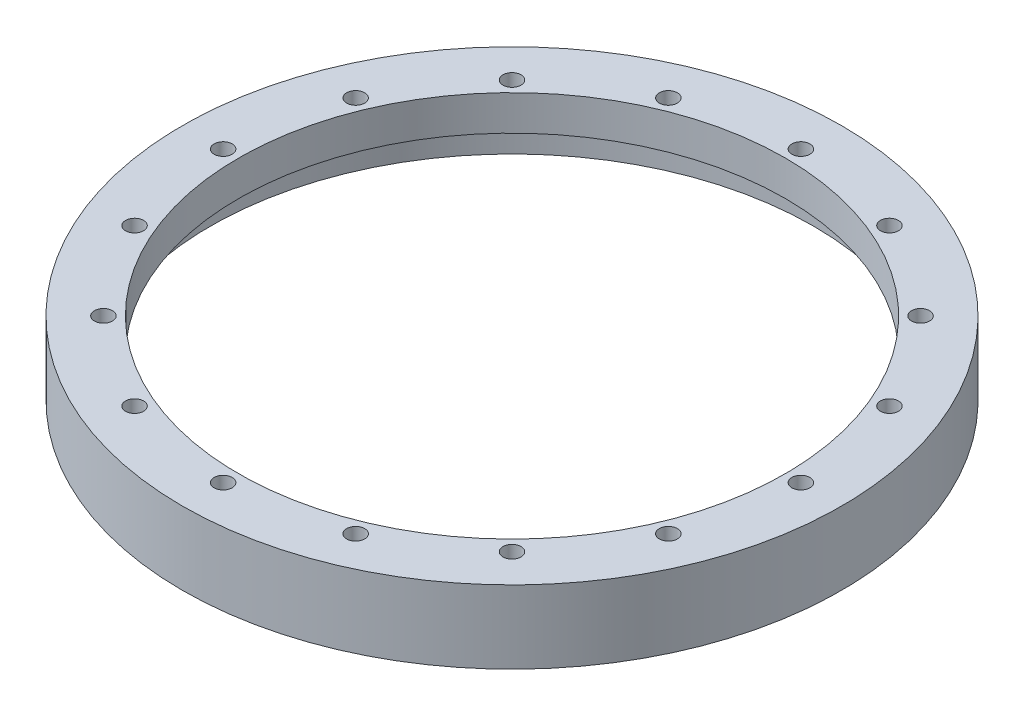
ISO-10303-21;
HEADER;
FILE_DESCRIPTION(('STEP AP214'),'2;1');
FILE_NAME('part.step','',(''),(''),'','','');
FILE_SCHEMA(('AUTOMOTIVE_DESIGN { 1 0 10303 214 1 1 1 1 }'));
ENDSEC;
DATA;
#1=APPLICATION_CONTEXT('core data for automotive mechanical design processes');
#2=APPLICATION_PROTOCOL_DEFINITION('international standard','automotive_design',2000,#1);
#3=PRODUCT_CONTEXT('',#1,'mechanical');
#4=PRODUCT('Part','Part','',(#3));
#5=PRODUCT_RELATED_PRODUCT_CATEGORY('part','',(#4));
#6=PRODUCT_DEFINITION_FORMATION('','',#4);
#7=PRODUCT_DEFINITION_CONTEXT('part definition',#1,'design');
#8=PRODUCT_DEFINITION('design','',#6,#7);
#9=PRODUCT_DEFINITION_SHAPE('','',#8);
#10=(LENGTH_UNIT() NAMED_UNIT(*) SI_UNIT(.MILLI.,.METRE.));
#11=(NAMED_UNIT(*) PLANE_ANGLE_UNIT() SI_UNIT($,.RADIAN.));
#12=(NAMED_UNIT(*) SI_UNIT($,.STERADIAN.) SOLID_ANGLE_UNIT());
#13=UNCERTAINTY_MEASURE_WITH_UNIT(LENGTH_MEASURE(1.E-05),#10,'distance_accuracy_value','');
#14=(GEOMETRIC_REPRESENTATION_CONTEXT(3) GLOBAL_UNCERTAINTY_ASSIGNED_CONTEXT((#13)) GLOBAL_UNIT_ASSIGNED_CONTEXT((#10,
#11,#12)) REPRESENTATION_CONTEXT('',''));
#15=CARTESIAN_POINT('',(0.,0.,0.));
#16=DIRECTION('',(0.,0.,1.));
#17=DIRECTION('',(1.,0.,0.));
#18=AXIS2_PLACEMENT_3D('',#15,#16,#17);
#19=CARTESIAN_POINT('',(-49.4665,0.,0.));
#20=DIRECTION('',(0.,-1.,0.));
#21=DIRECTION('',(0.,0.,-1.));
#22=AXIS2_PLACEMENT_3D('',#19,#20,#21);
#23=PLANE('',#22);
#24=CARTESIAN_POINT('',(-36.9591420918718,0.,-36.9591420918727));
#25=DIRECTION('',(0.,1.,0.));
#26=DIRECTION('',(0.,0.,1.));
#27=AXIS2_PLACEMENT_3D('',#24,#25,#26);
#28=CIRCLE('',#27,1.63195);
#29=CARTESIAN_POINT('',(-36.9591420918718,0.,-35.3271920918727));
#30=VERTEX_POINT('',#29);
#31=EDGE_CURVE('E99',#30,#30,#28,.T.);
#32=ORIENTED_EDGE('',*,*,#31,.F.);
#33=EDGE_LOOP('',(#32));
#34=FACE_BOUND('',#33,.T.);
#35=CARTESIAN_POINT('',(-36.9591420918725,0.,36.9591420918719));
#36=DIRECTION('',(0.,1.,0.));
#37=DIRECTION('',(0.,0.,1.));
#38=AXIS2_PLACEMENT_3D('',#35,#36,#37);
#39=CIRCLE('',#38,1.63195);
#40=CARTESIAN_POINT('',(-36.9591420918725,0.,38.5910920918719));
#41=VERTEX_POINT('',#40);
#42=EDGE_CURVE('E85',#41,#41,#39,.T.);
#43=ORIENTED_EDGE('',*,*,#42,.F.);
#44=EDGE_LOOP('',(#43));
#45=FACE_BOUND('',#44,.T.);
#46=CARTESIAN_POINT('',(-20.0021435648708,0.,48.2894462708437));
#47=DIRECTION('',(0.,1.,0.));
#48=DIRECTION('',(0.,0.,1.));
#49=AXIS2_PLACEMENT_3D('',#46,#47,#48);
#50=CIRCLE('',#49,1.63195);
#51=CARTESIAN_POINT('',(-20.0021435648708,0.,49.9213962708437));
#52=VERTEX_POINT('',#51);
#53=EDGE_CURVE('E81',#52,#52,#50,.T.);
#54=ORIENTED_EDGE('',*,*,#53,.F.);
#55=EDGE_LOOP('',(#54));
#56=FACE_BOUND('',#55,.T.);
#57=CARTESIAN_POINT('',(-3.64986542592937E-13,0.,52.26812));
#58=DIRECTION('',(0.,1.,0.));
#59=DIRECTION('',(0.,0.,1.));
#60=AXIS2_PLACEMENT_3D('',#57,#58,#59);
#61=CIRCLE('',#60,1.63195);
#62=CARTESIAN_POINT('',(-3.64986542592937E-13,0.,53.90007));
#63=VERTEX_POINT('',#62);
#64=EDGE_CURVE('E77',#63,#63,#61,.T.);
#65=ORIENTED_EDGE('',*,*,#64,.F.);
#66=EDGE_LOOP('',(#65));
#67=FACE_BOUND('',#66,.T.);
#68=CARTESIAN_POINT('',(20.0021435648701,0.,48.289446270844));
#69=DIRECTION('',(0.,1.,0.));
#70=DIRECTION('',(0.,0.,1.));
#71=AXIS2_PLACEMENT_3D('',#68,#69,#70);
#72=CIRCLE('',#71,1.63195);
#73=CARTESIAN_POINT('',(20.0021435648701,0.,49.9213962708439));
#74=VERTEX_POINT('',#73);
#75=EDGE_CURVE('E73',#74,#74,#72,.T.);
#76=ORIENTED_EDGE('',*,*,#75,.F.);
#77=EDGE_LOOP('',(#76));
#78=FACE_BOUND('',#77,.T.);
#79=CARTESIAN_POINT('',(36.959142091872,0.,36.9591420918724));
#80=DIRECTION('',(0.,1.,0.));
#81=DIRECTION('',(0.,0.,1.));
#82=AXIS2_PLACEMENT_3D('',#79,#80,#81);
#83=CIRCLE('',#82,1.63195);
#84=CARTESIAN_POINT('',(36.959142091872,0.,38.5910920918724));
#85=VERTEX_POINT('',#84);
#86=EDGE_CURVE('E69',#85,#85,#83,.T.);
#87=ORIENTED_EDGE('',*,*,#86,.F.);
#88=EDGE_LOOP('',(#87));
#89=FACE_BOUND('',#88,.T.);
#90=CARTESIAN_POINT('',(48.2894462708438,0.,20.0021435648706));
#91=DIRECTION('',(0.,1.,0.));
#92=DIRECTION('',(0.,0.,1.));
#93=AXIS2_PLACEMENT_3D('',#90,#91,#92);
#94=CIRCLE('',#93,1.63195);
#95=CARTESIAN_POINT('',(48.2894462708438,0.,21.6340935648706));
#96=VERTEX_POINT('',#95);
#97=EDGE_CURVE('E65',#96,#96,#94,.T.);
#98=ORIENTED_EDGE('',*,*,#97,.F.);
#99=EDGE_LOOP('',(#98));
#100=FACE_BOUND('',#99,.T.);
#101=CARTESIAN_POINT('',(52.26812,0.,1.82493271296469E-13));
#102=DIRECTION('',(0.,1.,0.));
#103=DIRECTION('',(0.,0.,1.));
#104=AXIS2_PLACEMENT_3D('',#101,#102,#103);
#105=CIRCLE('',#104,1.63195);
#106=CARTESIAN_POINT('',(52.26812,0.,1.63195000000018));
#107=VERTEX_POINT('',#106);
#108=EDGE_CURVE('E64',#107,#107,#105,.T.);
#109=ORIENTED_EDGE('',*,*,#108,.F.);
#110=EDGE_LOOP('',(#109));
#111=FACE_BOUND('',#110,.T.);
#112=CARTESIAN_POINT('',(48.2894462708439,0.,-20.0021435648703));
#113=DIRECTION('',(0.,1.,0.));
#114=DIRECTION('',(0.,0.,1.));
#115=AXIS2_PLACEMENT_3D('',#112,#113,#114);
#116=CIRCLE('',#115,1.63195);
#117=CARTESIAN_POINT('',(48.2894462708439,0.,-18.3701935648703));
#118=VERTEX_POINT('',#117);
#119=EDGE_CURVE('E60',#118,#118,#116,.T.);
#120=ORIENTED_EDGE('',*,*,#119,.F.);
#121=EDGE_LOOP('',(#120));
#122=FACE_BOUND('',#121,.T.);
#123=CARTESIAN_POINT('',(36.9591420918723,0.,-36.9591420918721));
#124=DIRECTION('',(0.,1.,0.));
#125=DIRECTION('',(0.,0.,1.));
#126=AXIS2_PLACEMENT_3D('',#123,#124,#125);
#127=CIRCLE('',#126,1.63195);
#128=CARTESIAN_POINT('',(36.9591420918723,0.,-35.3271920918721));
#129=VERTEX_POINT('',#128);
#130=EDGE_CURVE('E56',#129,#129,#127,.T.);
#131=ORIENTED_EDGE('',*,*,#130,.F.);
#132=EDGE_LOOP('',(#131));
#133=FACE_BOUND('',#132,.T.);
#134=CARTESIAN_POINT('',(20.0021435648704,0.,-48.2894462708438));
#135=DIRECTION('',(0.,1.,0.));
#136=DIRECTION('',(0.,0.,1.));
#137=AXIS2_PLACEMENT_3D('',#134,#135,#136);
#138=CIRCLE('',#137,1.63195);
#139=CARTESIAN_POINT('',(20.0021435648704,0.,-46.6574962708438));
#140=VERTEX_POINT('',#139);
#141=EDGE_CURVE('E55',#140,#140,#138,.T.);
#142=ORIENTED_EDGE('',*,*,#141,.F.);
#143=EDGE_LOOP('',(#142));
#144=FACE_BOUND('',#143,.T.);
#145=CARTESIAN_POINT('',(0.,0.,-52.26812));
#146=DIRECTION('',(0.,1.,0.));
#147=DIRECTION('',(0.,0.,1.));
#148=AXIS2_PLACEMENT_3D('',#145,#146,#147);
#149=CIRCLE('',#148,1.63195);
#150=CARTESIAN_POINT('',(0.,0.,-50.63617));
#151=VERTEX_POINT('',#150);
#152=EDGE_CURVE('E142',#151,#151,#149,.T.);
#153=ORIENTED_EDGE('',*,*,#152,.F.);
#154=EDGE_LOOP('',(#153));
#155=FACE_BOUND('',#154,.T.);
#156=CARTESIAN_POINT('',(0.,0.,0.));
#157=DIRECTION('',(0.,-1.,0.));
#158=DIRECTION('',(0.,0.,-1.));
#159=AXIS2_PLACEMENT_3D('',#156,#157,#158);
#160=CIRCLE('',#159,59.6265);
#161=CARTESIAN_POINT('',(0.,0.,-59.6265));
#162=VERTEX_POINT('',#161);
#163=EDGE_CURVE('E43',#162,#162,#160,.T.);
#164=ORIENTED_EDGE('',*,*,#163,.F.);
#165=EDGE_LOOP('',(#164));
#166=FACE_BOUND('',#165,.T.);
#167=CARTESIAN_POINT('',(0.,0.,0.));
#168=DIRECTION('',(0.,-1.,0.));
#169=DIRECTION('',(0.,0.,-1.));
#170=AXIS2_PLACEMENT_3D('',#167,#168,#169);
#171=CIRCLE('',#170,49.4665);
#172=CARTESIAN_POINT('',(0.,0.,-49.4665));
#173=VERTEX_POINT('',#172);
#174=EDGE_CURVE('E10',#173,#173,#171,.T.);
#175=ORIENTED_EDGE('',*,*,#174,.T.);
#176=EDGE_LOOP('',(#175));
#177=FACE_BOUND('',#176,.T.);
#178=CARTESIAN_POINT('',(-48.289446270844,0.,20.0021435648699));
#179=DIRECTION('',(0.,1.,0.));
#180=DIRECTION('',(0.,0.,1.));
#181=AXIS2_PLACEMENT_3D('',#178,#179,#180);
#182=CIRCLE('',#181,1.63195);
#183=CARTESIAN_POINT('',(-48.289446270844,0.,21.6340935648699));
#184=VERTEX_POINT('',#183);
#185=EDGE_CURVE('E89',#184,#184,#182,.T.);
#186=ORIENTED_EDGE('',*,*,#185,.F.);
#187=EDGE_LOOP('',(#186));
#188=FACE_BOUND('',#187,.T.);
#189=CARTESIAN_POINT('',(-52.26812,0.,-5.47479813889405E-13));
#190=DIRECTION('',(0.,1.,0.));
#191=DIRECTION('',(0.,0.,1.));
#192=AXIS2_PLACEMENT_3D('',#189,#190,#191);
#193=CIRCLE('',#192,1.63195);
#194=CARTESIAN_POINT('',(-52.26812,0.,1.63194999999945));
#195=VERTEX_POINT('',#194);
#196=EDGE_CURVE('E93',#195,#195,#193,.T.);
#197=ORIENTED_EDGE('',*,*,#196,.F.);
#198=EDGE_LOOP('',(#197));
#199=FACE_BOUND('',#198,.T.);
#200=CARTESIAN_POINT('',(-48.2894462708436,0.,-20.0021435648709));
#201=DIRECTION('',(0.,1.,0.));
#202=DIRECTION('',(0.,0.,1.));
#203=AXIS2_PLACEMENT_3D('',#200,#201,#202);
#204=CIRCLE('',#203,1.63195);
#205=CARTESIAN_POINT('',(-48.2894462708436,0.,-18.3701935648709));
#206=VERTEX_POINT('',#205);
#207=EDGE_CURVE('E96',#206,#206,#204,.T.);
#208=ORIENTED_EDGE('',*,*,#207,.F.);
#209=EDGE_LOOP('',(#208));
#210=FACE_BOUND('',#209,.T.);
#211=CARTESIAN_POINT('',(-20.0021435648697,0.,-48.2894462708441));
#212=DIRECTION('',(0.,1.,0.));
#213=DIRECTION('',(0.,0.,1.));
#214=AXIS2_PLACEMENT_3D('',#211,#212,#213);
#215=CIRCLE('',#214,1.63195);
#216=CARTESIAN_POINT('',(-20.0021435648697,0.,-46.6574962708441));
#217=VERTEX_POINT('',#216);
#218=EDGE_CURVE('E109',#217,#217,#215,.T.);
#219=ORIENTED_EDGE('',*,*,#218,.F.);
#220=EDGE_LOOP('',(#219));
#221=FACE_BOUND('',#220,.T.);
#222=ADVANCED_FACE('F35',(#34,#45,#56,#67,#78,#89,#100,#111,#122,#133,#144,#155,#166,#177,#188,
#199,#210,#221),#23,.F.);
#223=CARTESIAN_POINT('',(0.,0.,0.));
#224=DIRECTION('',(0.,-1.,0.));
#225=DIRECTION('',(0.,0.,-1.));
#226=AXIS2_PLACEMENT_3D('',#223,#224,#225);
#227=CYLINDRICAL_SURFACE('',#226,49.4665);
#228=ORIENTED_EDGE('',*,*,#174,.F.);
#229=EDGE_LOOP('',(#228));
#230=FACE_BOUND('',#229,.T.);
#231=CARTESIAN_POINT('',(0.,-6.34999999999999,0.));
#232=DIRECTION('',(0.,-1.,0.));
#233=DIRECTION('',(0.,0.,-1.));
#234=AXIS2_PLACEMENT_3D('',#231,#232,#233);
#235=CIRCLE('',#234,49.4665);
#236=CARTESIAN_POINT('',(0.,-6.34999999999999,-49.4665));
#237=VERTEX_POINT('',#236);
#238=EDGE_CURVE('E148',#237,#237,#235,.T.);
#239=ORIENTED_EDGE('',*,*,#238,.T.);
#240=EDGE_LOOP('',(#239));
#241=FACE_BOUND('',#240,.T.);
#242=ADVANCED_FACE('F37',(#230,#241),#227,.F.);
#243=CARTESIAN_POINT('',(0.,0.,0.));
#244=DIRECTION('',(0.,-1.,0.));
#245=DIRECTION('',(0.,0.,-1.));
#246=AXIS2_PLACEMENT_3D('',#243,#244,#245);
#247=CYLINDRICAL_SURFACE('',#246,59.6265);
#248=CARTESIAN_POINT('',(0.,-13.208,0.));
#249=DIRECTION('',(0.,-1.,0.));
#250=DIRECTION('',(0.,0.,-1.));
#251=AXIS2_PLACEMENT_3D('',#248,#249,#250);
#252=CIRCLE('',#251,59.6265);
#253=CARTESIAN_POINT('',(0.,-13.208,-59.6265));
#254=VERTEX_POINT('',#253);
#255=EDGE_CURVE('E48',#254,#254,#252,.T.);
#256=ORIENTED_EDGE('',*,*,#255,.F.);
#257=EDGE_LOOP('',(#256));
#258=FACE_BOUND('',#257,.T.);
#259=ORIENTED_EDGE('',*,*,#163,.T.);
#260=EDGE_LOOP('',(#259));
#261=FACE_BOUND('',#260,.T.);
#262=ADVANCED_FACE('F161',(#258,#261),#247,.T.);
#263=CARTESIAN_POINT('',(-59.6265,-13.208,0.));
#264=DIRECTION('',(0.,1.,0.));
#265=DIRECTION('',(0.,0.,1.));
#266=AXIS2_PLACEMENT_3D('',#263,#264,#265);
#267=PLANE('',#266);
#268=CARTESIAN_POINT('',(0.,-13.208,0.));
#269=DIRECTION('',(0.,-1.,0.));
#270=DIRECTION('',(0.,0.,-1.));
#271=AXIS2_PLACEMENT_3D('',#268,#269,#270);
#272=CIRCLE('',#271,54.5465);
#273=CARTESIAN_POINT('',(0.,-13.208,-54.5465));
#274=VERTEX_POINT('',#273);
#275=EDGE_CURVE('E154',#274,#274,#272,.T.);
#276=ORIENTED_EDGE('',*,*,#275,.F.);
#277=EDGE_LOOP('',(#276));
#278=FACE_BOUND('',#277,.T.);
#279=ORIENTED_EDGE('',*,*,#255,.T.);
#280=EDGE_LOOP('',(#279));
#281=FACE_BOUND('',#280,.T.);
#282=ADVANCED_FACE('F159',(#278,#281),#267,.F.);
#283=CARTESIAN_POINT('',(0.,0.,0.));
#284=DIRECTION('',(0.,-1.,0.));
#285=DIRECTION('',(0.,0.,-1.));
#286=AXIS2_PLACEMENT_3D('',#283,#284,#285);
#287=CYLINDRICAL_SURFACE('',#286,54.5465);
#288=CARTESIAN_POINT('',(0.,-6.35,0.));
#289=DIRECTION('',(0.,-1.,0.));
#290=DIRECTION('',(0.,0.,-1.));
#291=AXIS2_PLACEMENT_3D('',#288,#289,#290);
#292=CIRCLE('',#291,54.5465);
#293=CARTESIAN_POINT('',(0.,-6.35,-54.5465));
#294=VERTEX_POINT('',#293);
#295=EDGE_CURVE('E151',#294,#294,#292,.T.);
#296=ORIENTED_EDGE('',*,*,#295,.F.);
#297=EDGE_LOOP('',(#296));
#298=FACE_BOUND('',#297,.T.);
#299=ORIENTED_EDGE('',*,*,#275,.T.);
#300=EDGE_LOOP('',(#299));
#301=FACE_BOUND('',#300,.T.);
#302=ADVANCED_FACE('F189',(#298,#301),#287,.F.);
#303=CARTESIAN_POINT('',(-54.5465,-6.35,0.));
#304=DIRECTION('',(0.,1.,0.));
#305=DIRECTION('',(0.,0.,1.));
#306=AXIS2_PLACEMENT_3D('',#303,#304,#305);
#307=PLANE('',#306);
#308=CARTESIAN_POINT('',(-20.0021435648697,-6.35,-48.2894462708441));
#309=DIRECTION('',(0.,1.,0.));
#310=DIRECTION('',(0.,0.,1.));
#311=AXIS2_PLACEMENT_3D('',#308,#309,#310);
#312=CIRCLE('',#311,1.63195);
#313=CARTESIAN_POINT('',(-20.0021435648697,-6.35,-46.6574962708441));
#314=VERTEX_POINT('',#313);
#315=EDGE_CURVE('E39',#314,#314,#312,.T.);
#316=ORIENTED_EDGE('',*,*,#315,.T.);
#317=EDGE_LOOP('',(#316));
#318=FACE_BOUND('',#317,.T.);
#319=CARTESIAN_POINT('',(-36.9591420918718,-6.35,-36.9591420918727));
#320=DIRECTION('',(0.,1.,0.));
#321=DIRECTION('',(0.,0.,1.));
#322=AXIS2_PLACEMENT_3D('',#319,#320,#321);
#323=CIRCLE('',#322,1.63195);
#324=CARTESIAN_POINT('',(-36.9591420918718,-6.35,-35.3271920918727));
#325=VERTEX_POINT('',#324);
#326=EDGE_CURVE('E97',#325,#325,#323,.T.);
#327=ORIENTED_EDGE('',*,*,#326,.T.);
#328=EDGE_LOOP('',(#327));
#329=FACE_BOUND('',#328,.T.);
#330=CARTESIAN_POINT('',(-48.2894462708436,-6.35,-20.0021435648709));
#331=DIRECTION('',(0.,1.,0.));
#332=DIRECTION('',(0.,0.,1.));
#333=AXIS2_PLACEMENT_3D('',#330,#331,#332);
#334=CIRCLE('',#333,1.63195);
#335=CARTESIAN_POINT('',(-48.2894462708436,-6.35,-18.3701935648709));
#336=VERTEX_POINT('',#335);
#337=EDGE_CURVE('E94',#336,#336,#334,.T.);
#338=ORIENTED_EDGE('',*,*,#337,.T.);
#339=EDGE_LOOP('',(#338));
#340=FACE_BOUND('',#339,.T.);
#341=CARTESIAN_POINT('',(-52.26812,-6.35,-5.47479813889405E-13));
#342=DIRECTION('',(0.,1.,0.));
#343=DIRECTION('',(0.,0.,1.));
#344=AXIS2_PLACEMENT_3D('',#341,#342,#343);
#345=CIRCLE('',#344,1.63195);
#346=CARTESIAN_POINT('',(-52.26812,-6.35,1.63194999999945));
#347=VERTEX_POINT('',#346);
#348=EDGE_CURVE('E90',#347,#347,#345,.T.);
#349=ORIENTED_EDGE('',*,*,#348,.T.);
#350=EDGE_LOOP('',(#349));
#351=FACE_BOUND('',#350,.T.);
#352=CARTESIAN_POINT('',(-48.289446270844,-6.35,20.0021435648699));
#353=DIRECTION('',(0.,1.,0.));
#354=DIRECTION('',(0.,0.,1.));
#355=AXIS2_PLACEMENT_3D('',#352,#353,#354);
#356=CIRCLE('',#355,1.63195);
#357=CARTESIAN_POINT('',(-48.289446270844,-6.35,21.6340935648699));
#358=VERTEX_POINT('',#357);
#359=EDGE_CURVE('E86',#358,#358,#356,.T.);
#360=ORIENTED_EDGE('',*,*,#359,.T.);
#361=EDGE_LOOP('',(#360));
#362=FACE_BOUND('',#361,.T.);
#363=CARTESIAN_POINT('',(-36.9591420918725,-6.35,36.9591420918719));
#364=DIRECTION('',(0.,1.,0.));
#365=DIRECTION('',(0.,0.,1.));
#366=AXIS2_PLACEMENT_3D('',#363,#364,#365);
#367=CIRCLE('',#366,1.63195);
#368=CARTESIAN_POINT('',(-36.9591420918725,-6.35,38.5910920918719));
#369=VERTEX_POINT('',#368);
#370=EDGE_CURVE('E82',#369,#369,#367,.T.);
#371=ORIENTED_EDGE('',*,*,#370,.T.);
#372=EDGE_LOOP('',(#371));
#373=FACE_BOUND('',#372,.T.);
#374=CARTESIAN_POINT('',(-20.0021435648708,-6.35,48.2894462708437));
#375=DIRECTION('',(0.,1.,0.));
#376=DIRECTION('',(0.,0.,1.));
#377=AXIS2_PLACEMENT_3D('',#374,#375,#376);
#378=CIRCLE('',#377,1.63195);
#379=CARTESIAN_POINT('',(-20.0021435648708,-6.35,49.9213962708437));
#380=VERTEX_POINT('',#379);
#381=EDGE_CURVE('E78',#380,#380,#378,.T.);
#382=ORIENTED_EDGE('',*,*,#381,.T.);
#383=EDGE_LOOP('',(#382));
#384=FACE_BOUND('',#383,.T.);
#385=CARTESIAN_POINT('',(-3.64986542592937E-13,-6.35,52.26812));
#386=DIRECTION('',(0.,1.,0.));
#387=DIRECTION('',(0.,0.,1.));
#388=AXIS2_PLACEMENT_3D('',#385,#386,#387);
#389=CIRCLE('',#388,1.63195);
#390=CARTESIAN_POINT('',(-3.64986542592937E-13,-6.35,53.90007));
#391=VERTEX_POINT('',#390);
#392=EDGE_CURVE('E74',#391,#391,#389,.T.);
#393=ORIENTED_EDGE('',*,*,#392,.T.);
#394=EDGE_LOOP('',(#393));
#395=FACE_BOUND('',#394,.T.);
#396=CARTESIAN_POINT('',(20.0021435648701,-6.35,48.289446270844));
#397=DIRECTION('',(0.,1.,0.));
#398=DIRECTION('',(0.,0.,1.));
#399=AXIS2_PLACEMENT_3D('',#396,#397,#398);
#400=CIRCLE('',#399,1.63195);
#401=CARTESIAN_POINT('',(20.0021435648701,-6.35,49.9213962708439));
#402=VERTEX_POINT('',#401);
#403=EDGE_CURVE('E70',#402,#402,#400,.T.);
#404=ORIENTED_EDGE('',*,*,#403,.T.);
#405=EDGE_LOOP('',(#404));
#406=FACE_BOUND('',#405,.T.);
#407=CARTESIAN_POINT('',(36.959142091872,-6.35,36.9591420918724));
#408=DIRECTION('',(0.,1.,0.));
#409=DIRECTION('',(0.,0.,1.));
#410=AXIS2_PLACEMENT_3D('',#407,#408,#409);
#411=CIRCLE('',#410,1.63195);
#412=CARTESIAN_POINT('',(36.959142091872,-6.35,38.5910920918724));
#413=VERTEX_POINT('',#412);
#414=EDGE_CURVE('E66',#413,#413,#411,.T.);
#415=ORIENTED_EDGE('',*,*,#414,.T.);
#416=EDGE_LOOP('',(#415));
#417=FACE_BOUND('',#416,.T.);
#418=CARTESIAN_POINT('',(48.2894462708438,-6.35,20.0021435648706));
#419=DIRECTION('',(0.,1.,0.));
#420=DIRECTION('',(0.,0.,1.));
#421=AXIS2_PLACEMENT_3D('',#418,#419,#420);
#422=CIRCLE('',#421,1.63195);
#423=CARTESIAN_POINT('',(48.2894462708438,-6.35,21.6340935648706));
#424=VERTEX_POINT('',#423);
#425=EDGE_CURVE('E61',#424,#424,#422,.T.);
#426=ORIENTED_EDGE('',*,*,#425,.T.);
#427=EDGE_LOOP('',(#426));
#428=FACE_BOUND('',#427,.T.);
#429=CARTESIAN_POINT('',(52.26812,-6.35,1.82493271296469E-13));
#430=DIRECTION('',(0.,1.,0.));
#431=DIRECTION('',(0.,0.,1.));
#432=AXIS2_PLACEMENT_3D('',#429,#430,#431);
#433=CIRCLE('',#432,1.63195);
#434=CARTESIAN_POINT('',(52.26812,-6.35,1.63195000000018));
#435=VERTEX_POINT('',#434);
#436=EDGE_CURVE('E130',#435,#435,#433,.T.);
#437=ORIENTED_EDGE('',*,*,#436,.T.);
#438=EDGE_LOOP('',(#437));
#439=FACE_BOUND('',#438,.T.);
#440=CARTESIAN_POINT('',(48.2894462708439,-6.35,-20.0021435648703));
#441=DIRECTION('',(0.,1.,0.));
#442=DIRECTION('',(0.,0.,1.));
#443=AXIS2_PLACEMENT_3D('',#440,#441,#442);
#444=CIRCLE('',#443,1.63195);
#445=CARTESIAN_POINT('',(48.2894462708439,-6.35,-18.3701935648703));
#446=VERTEX_POINT('',#445);
#447=EDGE_CURVE('E57',#446,#446,#444,.T.);
#448=ORIENTED_EDGE('',*,*,#447,.T.);
#449=EDGE_LOOP('',(#448));
#450=FACE_BOUND('',#449,.T.);
#451=CARTESIAN_POINT('',(36.9591420918723,-6.35,-36.9591420918721));
#452=DIRECTION('',(0.,1.,0.));
#453=DIRECTION('',(0.,0.,1.));
#454=AXIS2_PLACEMENT_3D('',#451,#452,#453);
#455=CIRCLE('',#454,1.63195);
#456=CARTESIAN_POINT('',(36.9591420918723,-6.35,-35.3271920918721));
#457=VERTEX_POINT('',#456);
#458=EDGE_CURVE('E52',#457,#457,#455,.T.);
#459=ORIENTED_EDGE('',*,*,#458,.T.);
#460=EDGE_LOOP('',(#459));
#461=FACE_BOUND('',#460,.T.);
#462=CARTESIAN_POINT('',(20.0021435648704,-6.35,-48.2894462708438));
#463=DIRECTION('',(0.,1.,0.));
#464=DIRECTION('',(0.,0.,1.));
#465=AXIS2_PLACEMENT_3D('',#462,#463,#464);
#466=CIRCLE('',#465,1.63195);
#467=CARTESIAN_POINT('',(20.0021435648704,-6.35,-46.6574962708438));
#468=VERTEX_POINT('',#467);
#469=EDGE_CURVE('E139',#468,#468,#466,.T.);
#470=ORIENTED_EDGE('',*,*,#469,.T.);
#471=EDGE_LOOP('',(#470));
#472=FACE_BOUND('',#471,.T.);
#473=CARTESIAN_POINT('',(0.,-6.35,-52.26812));
#474=DIRECTION('',(0.,1.,0.));
#475=DIRECTION('',(0.,0.,1.));
#476=AXIS2_PLACEMENT_3D('',#473,#474,#475);
#477=CIRCLE('',#476,1.63195);
#478=CARTESIAN_POINT('',(0.,-6.35,-50.63617));
#479=VERTEX_POINT('',#478);
#480=EDGE_CURVE('E145',#479,#479,#477,.T.);
#481=ORIENTED_EDGE('',*,*,#480,.T.);
#482=EDGE_LOOP('',(#481));
#483=FACE_BOUND('',#482,.T.);
#484=ORIENTED_EDGE('',*,*,#238,.F.);
#485=EDGE_LOOP('',(#484));
#486=FACE_BOUND('',#485,.T.);
#487=ORIENTED_EDGE('',*,*,#295,.T.);
#488=EDGE_LOOP('',(#487));
#489=FACE_BOUND('',#488,.T.);
#490=ADVANCED_FACE('F186',(#318,#329,#340,#351,#362,#373,#384,#395,#406,#417,#428,#439,#450,
#461,#472,#483,#486,#489),#307,.F.);
#491=CARTESIAN_POINT('',(0.,0.,-52.26812));
#492=DIRECTION('',(0.,1.,0.));
#493=DIRECTION('',(0.,0.,1.));
#494=AXIS2_PLACEMENT_3D('',#491,#492,#493);
#495=CYLINDRICAL_SURFACE('',#494,1.63195);
#496=ORIENTED_EDGE('',*,*,#152,.T.);
#497=EDGE_LOOP('',(#496));
#498=FACE_BOUND('',#497,.T.);
#499=ORIENTED_EDGE('',*,*,#480,.F.);
#500=EDGE_LOOP('',(#499));
#501=FACE_BOUND('',#500,.T.);
#502=ADVANCED_FACE('F188',(#498,#501),#495,.F.);
#503=CARTESIAN_POINT('',(20.0021435648704,0.,-48.2894462708438));
#504=DIRECTION('',(0.,1.,0.));
#505=DIRECTION('',(0.,0.,1.));
#506=AXIS2_PLACEMENT_3D('',#503,#504,#505);
#507=CYLINDRICAL_SURFACE('',#506,1.63195);
#508=ORIENTED_EDGE('',*,*,#141,.T.);
#509=EDGE_LOOP('',(#508));
#510=FACE_BOUND('',#509,.T.);
#511=ORIENTED_EDGE('',*,*,#469,.F.);
#512=EDGE_LOOP('',(#511));
#513=FACE_BOUND('',#512,.T.);
#514=ADVANCED_FACE('F236',(#510,#513),#507,.F.);
#515=CARTESIAN_POINT('',(36.9591420918723,0.,-36.9591420918721));
#516=DIRECTION('',(0.,1.,0.));
#517=DIRECTION('',(0.,0.,1.));
#518=AXIS2_PLACEMENT_3D('',#515,#516,#517);
#519=CYLINDRICAL_SURFACE('',#518,1.63195);
#520=ORIENTED_EDGE('',*,*,#130,.T.);
#521=EDGE_LOOP('',(#520));
#522=FACE_BOUND('',#521,.T.);
#523=ORIENTED_EDGE('',*,*,#458,.F.);
#524=EDGE_LOOP('',(#523));
#525=FACE_BOUND('',#524,.T.);
#526=ADVANCED_FACE('F240',(#522,#525),#519,.F.);
#527=CARTESIAN_POINT('',(48.2894462708439,0.,-20.0021435648703));
#528=DIRECTION('',(0.,1.,0.));
#529=DIRECTION('',(0.,0.,1.));
#530=AXIS2_PLACEMENT_3D('',#527,#528,#529);
#531=CYLINDRICAL_SURFACE('',#530,1.63195);
#532=ORIENTED_EDGE('',*,*,#119,.T.);
#533=EDGE_LOOP('',(#532));
#534=FACE_BOUND('',#533,.T.);
#535=ORIENTED_EDGE('',*,*,#447,.F.);
#536=EDGE_LOOP('',(#535));
#537=FACE_BOUND('',#536,.T.);
#538=ADVANCED_FACE('F244',(#534,#537),#531,.F.);
#539=CARTESIAN_POINT('',(52.26812,0.,1.82493271296469E-13));
#540=DIRECTION('',(0.,1.,0.));
#541=DIRECTION('',(0.,0.,1.));
#542=AXIS2_PLACEMENT_3D('',#539,#540,#541);
#543=CYLINDRICAL_SURFACE('',#542,1.63195);
#544=ORIENTED_EDGE('',*,*,#108,.T.);
#545=EDGE_LOOP('',(#544));
#546=FACE_BOUND('',#545,.T.);
#547=ORIENTED_EDGE('',*,*,#436,.F.);
#548=EDGE_LOOP('',(#547));
#549=FACE_BOUND('',#548,.T.);
#550=ADVANCED_FACE('F248',(#546,#549),#543,.F.);
#551=CARTESIAN_POINT('',(48.2894462708438,0.,20.0021435648706));
#552=DIRECTION('',(0.,1.,0.));
#553=DIRECTION('',(0.,0.,1.));
#554=AXIS2_PLACEMENT_3D('',#551,#552,#553);
#555=CYLINDRICAL_SURFACE('',#554,1.63195);
#556=ORIENTED_EDGE('',*,*,#97,.T.);
#557=EDGE_LOOP('',(#556));
#558=FACE_BOUND('',#557,.T.);
#559=ORIENTED_EDGE('',*,*,#425,.F.);
#560=EDGE_LOOP('',(#559));
#561=FACE_BOUND('',#560,.T.);
#562=ADVANCED_FACE('F252',(#558,#561),#555,.F.);
#563=CARTESIAN_POINT('',(36.959142091872,0.,36.9591420918724));
#564=DIRECTION('',(0.,1.,0.));
#565=DIRECTION('',(0.,0.,1.));
#566=AXIS2_PLACEMENT_3D('',#563,#564,#565);
#567=CYLINDRICAL_SURFACE('',#566,1.63195);
#568=ORIENTED_EDGE('',*,*,#86,.T.);
#569=EDGE_LOOP('',(#568));
#570=FACE_BOUND('',#569,.T.);
#571=ORIENTED_EDGE('',*,*,#414,.F.);
#572=EDGE_LOOP('',(#571));
#573=FACE_BOUND('',#572,.T.);
#574=ADVANCED_FACE('F256',(#570,#573),#567,.F.);
#575=CARTESIAN_POINT('',(20.0021435648701,0.,48.289446270844));
#576=DIRECTION('',(0.,1.,0.));
#577=DIRECTION('',(0.,0.,1.));
#578=AXIS2_PLACEMENT_3D('',#575,#576,#577);
#579=CYLINDRICAL_SURFACE('',#578,1.63195);
#580=ORIENTED_EDGE('',*,*,#75,.T.);
#581=EDGE_LOOP('',(#580));
#582=FACE_BOUND('',#581,.T.);
#583=ORIENTED_EDGE('',*,*,#403,.F.);
#584=EDGE_LOOP('',(#583));
#585=FACE_BOUND('',#584,.T.);
#586=ADVANCED_FACE('F260',(#582,#585),#579,.F.);
#587=CARTESIAN_POINT('',(-3.64986542592937E-13,0.,52.26812));
#588=DIRECTION('',(0.,1.,0.));
#589=DIRECTION('',(0.,0.,1.));
#590=AXIS2_PLACEMENT_3D('',#587,#588,#589);
#591=CYLINDRICAL_SURFACE('',#590,1.63195);
#592=ORIENTED_EDGE('',*,*,#64,.T.);
#593=EDGE_LOOP('',(#592));
#594=FACE_BOUND('',#593,.T.);
#595=ORIENTED_EDGE('',*,*,#392,.F.);
#596=EDGE_LOOP('',(#595));
#597=FACE_BOUND('',#596,.T.);
#598=ADVANCED_FACE('F264',(#594,#597),#591,.F.);
#599=CARTESIAN_POINT('',(-20.0021435648708,0.,48.2894462708437));
#600=DIRECTION('',(0.,1.,0.));
#601=DIRECTION('',(0.,0.,1.));
#602=AXIS2_PLACEMENT_3D('',#599,#600,#601);
#603=CYLINDRICAL_SURFACE('',#602,1.63195);
#604=ORIENTED_EDGE('',*,*,#53,.T.);
#605=EDGE_LOOP('',(#604));
#606=FACE_BOUND('',#605,.T.);
#607=ORIENTED_EDGE('',*,*,#381,.F.);
#608=EDGE_LOOP('',(#607));
#609=FACE_BOUND('',#608,.T.);
#610=ADVANCED_FACE('F268',(#606,#609),#603,.F.);
#611=CARTESIAN_POINT('',(-36.9591420918725,0.,36.9591420918719));
#612=DIRECTION('',(0.,1.,0.));
#613=DIRECTION('',(0.,0.,1.));
#614=AXIS2_PLACEMENT_3D('',#611,#612,#613);
#615=CYLINDRICAL_SURFACE('',#614,1.63195);
#616=ORIENTED_EDGE('',*,*,#42,.T.);
#617=EDGE_LOOP('',(#616));
#618=FACE_BOUND('',#617,.T.);
#619=ORIENTED_EDGE('',*,*,#370,.F.);
#620=EDGE_LOOP('',(#619));
#621=FACE_BOUND('',#620,.T.);
#622=ADVANCED_FACE('F272',(#618,#621),#615,.F.);
#623=CARTESIAN_POINT('',(-48.289446270844,0.,20.0021435648699));
#624=DIRECTION('',(0.,1.,0.));
#625=DIRECTION('',(0.,0.,1.));
#626=AXIS2_PLACEMENT_3D('',#623,#624,#625);
#627=CYLINDRICAL_SURFACE('',#626,1.63195);
#628=ORIENTED_EDGE('',*,*,#185,.T.);
#629=EDGE_LOOP('',(#628));
#630=FACE_BOUND('',#629,.T.);
#631=ORIENTED_EDGE('',*,*,#359,.F.);
#632=EDGE_LOOP('',(#631));
#633=FACE_BOUND('',#632,.T.);
#634=ADVANCED_FACE('F276',(#630,#633),#627,.F.);
#635=CARTESIAN_POINT('',(-52.26812,0.,-5.47479813889405E-13));
#636=DIRECTION('',(0.,1.,0.));
#637=DIRECTION('',(0.,0.,1.));
#638=AXIS2_PLACEMENT_3D('',#635,#636,#637);
#639=CYLINDRICAL_SURFACE('',#638,1.63195);
#640=ORIENTED_EDGE('',*,*,#196,.T.);
#641=EDGE_LOOP('',(#640));
#642=FACE_BOUND('',#641,.T.);
#643=ORIENTED_EDGE('',*,*,#348,.F.);
#644=EDGE_LOOP('',(#643));
#645=FACE_BOUND('',#644,.T.);
#646=ADVANCED_FACE('F280',(#642,#645),#639,.F.);
#647=CARTESIAN_POINT('',(-48.2894462708436,0.,-20.0021435648709));
#648=DIRECTION('',(0.,1.,0.));
#649=DIRECTION('',(0.,0.,1.));
#650=AXIS2_PLACEMENT_3D('',#647,#648,#649);
#651=CYLINDRICAL_SURFACE('',#650,1.63195);
#652=ORIENTED_EDGE('',*,*,#207,.T.);
#653=EDGE_LOOP('',(#652));
#654=FACE_BOUND('',#653,.T.);
#655=ORIENTED_EDGE('',*,*,#337,.F.);
#656=EDGE_LOOP('',(#655));
#657=FACE_BOUND('',#656,.T.);
#658=ADVANCED_FACE('F284',(#654,#657),#651,.F.);
#659=CARTESIAN_POINT('',(-36.9591420918718,0.,-36.9591420918727));
#660=DIRECTION('',(0.,1.,0.));
#661=DIRECTION('',(0.,0.,1.));
#662=AXIS2_PLACEMENT_3D('',#659,#660,#661);
#663=CYLINDRICAL_SURFACE('',#662,1.63195);
#664=ORIENTED_EDGE('',*,*,#31,.T.);
#665=EDGE_LOOP('',(#664));
#666=FACE_BOUND('',#665,.T.);
#667=ORIENTED_EDGE('',*,*,#326,.F.);
#668=EDGE_LOOP('',(#667));
#669=FACE_BOUND('',#668,.T.);
#670=ADVANCED_FACE('F182',(#666,#669),#663,.F.);
#671=CARTESIAN_POINT('',(-20.0021435648697,0.,-48.2894462708441));
#672=DIRECTION('',(0.,1.,0.));
#673=DIRECTION('',(0.,0.,1.));
#674=AXIS2_PLACEMENT_3D('',#671,#672,#673);
#675=CYLINDRICAL_SURFACE('',#674,1.63195);
#676=ORIENTED_EDGE('',*,*,#218,.T.);
#677=EDGE_LOOP('',(#676));
#678=FACE_BOUND('',#677,.T.);
#679=ORIENTED_EDGE('',*,*,#315,.F.);
#680=EDGE_LOOP('',(#679));
#681=FACE_BOUND('',#680,.T.);
#682=ADVANCED_FACE('F179',(#678,#681),#675,.F.);
#683=CLOSED_SHELL('',(#222,#242,#262,#282,#302,#490,#502,#514,#526,#538,#550,#562,#574,#586,
#598,#610,#622,#634,#646,#658,#670,#682));
#684=MANIFOLD_SOLID_BREP('B2',#683);
#685=ADVANCED_BREP_SHAPE_REPRESENTATION('',(#18,#684),#14);
#686=SHAPE_DEFINITION_REPRESENTATION(#9,#685);
ENDSEC;
END-ISO-10303-21;
